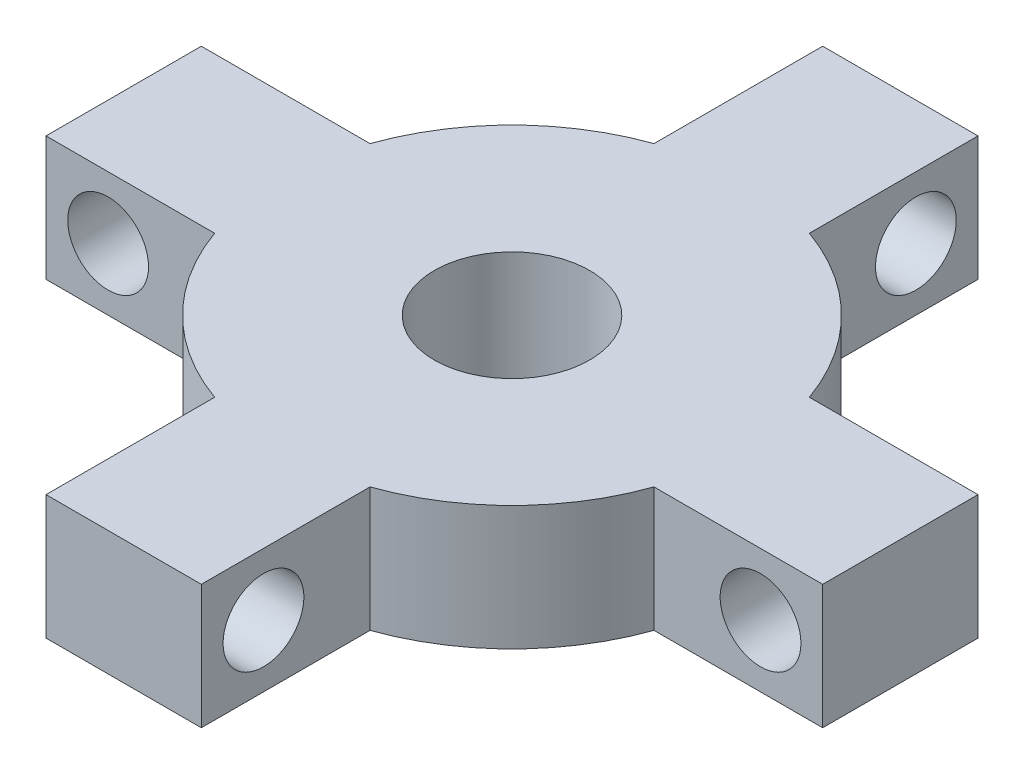
ISO-10303-21;
HEADER;
FILE_DESCRIPTION(('STEP AP214'),'2;1');
FILE_NAME('part.step','',(''),(''),'','','');
FILE_SCHEMA(('AUTOMOTIVE_DESIGN { 1 0 10303 214 1 1 1 1 }'));
ENDSEC;
DATA;
#1=APPLICATION_CONTEXT('core data for automotive mechanical design processes');
#2=APPLICATION_PROTOCOL_DEFINITION('international standard','automotive_design',2000,#1);
#3=PRODUCT_CONTEXT('',#1,'mechanical');
#4=PRODUCT('Part','Part','',(#3));
#5=PRODUCT_RELATED_PRODUCT_CATEGORY('part','',(#4));
#6=PRODUCT_DEFINITION_FORMATION('','',#4);
#7=PRODUCT_DEFINITION_CONTEXT('part definition',#1,'design');
#8=PRODUCT_DEFINITION('design','',#6,#7);
#9=PRODUCT_DEFINITION_SHAPE('','',#8);
#10=(LENGTH_UNIT() NAMED_UNIT(*) SI_UNIT(.MILLI.,.METRE.));
#11=(NAMED_UNIT(*) PLANE_ANGLE_UNIT() SI_UNIT($,.RADIAN.));
#12=(NAMED_UNIT(*) SI_UNIT($,.STERADIAN.) SOLID_ANGLE_UNIT());
#13=UNCERTAINTY_MEASURE_WITH_UNIT(LENGTH_MEASURE(1.E-05),#10,'distance_accuracy_value','');
#14=(GEOMETRIC_REPRESENTATION_CONTEXT(3) GLOBAL_UNCERTAINTY_ASSIGNED_CONTEXT((#13)) GLOBAL_UNIT_ASSIGNED_CONTEXT((#10,
#11,#12)) REPRESENTATION_CONTEXT('',''));
#15=CARTESIAN_POINT('',(0.,0.,0.));
#16=DIRECTION('',(0.,0.,1.));
#17=DIRECTION('',(1.,0.,0.));
#18=AXIS2_PLACEMENT_3D('',#15,#16,#17);
#19=CARTESIAN_POINT('',(0.,10.16,0.));
#20=DIRECTION('',(0.,-1.,0.));
#21=DIRECTION('',(0.,0.,-1.));
#22=AXIS2_PLACEMENT_3D('',#19,#20,#21);
#23=CYLINDRICAL_SURFACE('',#22,19.05);
#24=DIRECTION('',(0.,1.,0.));
#25=VECTOR('',#24,1.);
#26=CARTESIAN_POINT('',(-17.9605122421384,-6.44278538945158,-6.34999999999981));
#27=LINE('',#26,#25);
#28=CARTESIAN_POINT('',(-17.9605122421384,0.,-6.34999999999981));
#29=VERTEX_POINT('',#28);
#30=CARTESIAN_POINT('',(-17.9605122421384,10.16,-6.34999999999981));
#31=VERTEX_POINT('',#30);
#32=EDGE_CURVE('E120',#29,#31,#27,.T.);
#33=ORIENTED_EDGE('',*,*,#32,.T.);
#34=CARTESIAN_POINT('',(0.,10.16,0.));
#35=DIRECTION('',(0.,1.,0.));
#36=DIRECTION('',(0.,0.,1.));
#37=AXIS2_PLACEMENT_3D('',#34,#35,#36);
#38=CIRCLE('',#37,19.05);
#39=CARTESIAN_POINT('',(-6.35,10.16,-17.9605122421383));
#40=VERTEX_POINT('',#39);
#41=EDGE_CURVE('E447',#40,#31,#38,.T.);
#42=ORIENTED_EDGE('',*,*,#41,.F.);
#43=DIRECTION('',(0.,1.,0.));
#44=VECTOR('',#43,1.);
#45=CARTESIAN_POINT('',(-6.35,-6.44278538945156,-17.9605122421383));
#46=LINE('',#45,#44);
#47=CARTESIAN_POINT('',(-6.35,0.,-17.9605122421383));
#48=VERTEX_POINT('',#47);
#49=EDGE_CURVE('E308',#48,#40,#46,.T.);
#50=ORIENTED_EDGE('',*,*,#49,.F.);
#51=CARTESIAN_POINT('',(0.,0.,0.));
#52=DIRECTION('',(0.,1.,0.));
#53=DIRECTION('',(0.,0.,1.));
#54=AXIS2_PLACEMENT_3D('',#51,#52,#53);
#55=CIRCLE('',#54,19.05);
#56=EDGE_CURVE('E125',#48,#29,#55,.T.);
#57=ORIENTED_EDGE('',*,*,#56,.T.);
#58=EDGE_LOOP('',(#33,#42,#50,#57));
#59=FACE_BOUND('',#58,.T.);
#60=ADVANCED_FACE('F101',(#59),#23,.T.);
#61=DIRECTION('',(0.,1.,0.));
#62=VECTOR('',#61,1.);
#63=CARTESIAN_POINT('',(6.35,-6.44278538945156,-17.9605122421383));
#64=LINE('',#63,#62);
#65=CARTESIAN_POINT('',(6.35,0.,-17.9605122421383));
#66=VERTEX_POINT('',#65);
#67=CARTESIAN_POINT('',(6.35,10.16,-17.9605122421383));
#68=VERTEX_POINT('',#67);
#69=EDGE_CURVE('E226',#66,#68,#64,.T.);
#70=ORIENTED_EDGE('',*,*,#69,.T.);
#71=CARTESIAN_POINT('',(17.9605122421383,10.16,-6.35000000000006));
#72=VERTEX_POINT('',#71);
#73=EDGE_CURVE('E111',#72,#68,#38,.T.);
#74=ORIENTED_EDGE('',*,*,#73,.F.);
#75=DIRECTION('',(0.,1.,0.));
#76=VECTOR('',#75,1.);
#77=CARTESIAN_POINT('',(17.9605122421383,-6.44278538945157,-6.35000000000006));
#78=LINE('',#77,#76);
#79=CARTESIAN_POINT('',(17.9605122421383,0.,-6.35000000000006));
#80=VERTEX_POINT('',#79);
#81=EDGE_CURVE('E230',#80,#72,#78,.T.);
#82=ORIENTED_EDGE('',*,*,#81,.F.);
#83=EDGE_CURVE('E391',#80,#66,#55,.T.);
#84=ORIENTED_EDGE('',*,*,#83,.T.);
#85=EDGE_LOOP('',(#70,#74,#82,#84));
#86=FACE_BOUND('',#85,.T.);
#87=ADVANCED_FACE('F445',(#86),#23,.T.);
#88=DIRECTION('',(0.,1.,0.));
#89=VECTOR('',#88,1.);
#90=CARTESIAN_POINT('',(17.9605122421383,-6.44278538945157,6.34999999999993));
#91=LINE('',#90,#89);
#92=CARTESIAN_POINT('',(17.9605122421383,0.,6.34999999999994));
#93=VERTEX_POINT('',#92);
#94=CARTESIAN_POINT('',(17.9605122421383,10.16,6.34999999999994));
#95=VERTEX_POINT('',#94);
#96=EDGE_CURVE('E341',#93,#95,#91,.T.);
#97=ORIENTED_EDGE('',*,*,#96,.T.);
#98=CARTESIAN_POINT('',(6.35,10.16,17.9605122421383));
#99=VERTEX_POINT('',#98);
#100=EDGE_CURVE('E12',#99,#95,#38,.T.);
#101=ORIENTED_EDGE('',*,*,#100,.F.);
#102=DIRECTION('',(0.,1.,0.));
#103=VECTOR('',#102,1.);
#104=CARTESIAN_POINT('',(6.35,-6.44278538945156,17.9605122421383));
#105=LINE('',#104,#103);
#106=CARTESIAN_POINT('',(6.35,0.,17.9605122421383));
#107=VERTEX_POINT('',#106);
#108=EDGE_CURVE('E340',#107,#99,#105,.T.);
#109=ORIENTED_EDGE('',*,*,#108,.F.);
#110=EDGE_CURVE('E388',#107,#93,#55,.T.);
#111=ORIENTED_EDGE('',*,*,#110,.T.);
#112=EDGE_LOOP('',(#97,#101,#109,#111));
#113=FACE_BOUND('',#112,.T.);
#114=ADVANCED_FACE('F427',(#113),#23,.T.);
#115=CARTESIAN_POINT('',(-17.9605122421382,10.16,6.35000000000019));
#116=VERTEX_POINT('',#115);
#117=CARTESIAN_POINT('',(-6.35,10.16,17.9605122421383));
#118=VERTEX_POINT('',#117);
#119=EDGE_CURVE('E113',#116,#118,#38,.T.);
#120=ORIENTED_EDGE('',*,*,#119,.F.);
#121=DIRECTION('',(0.,1.,0.));
#122=VECTOR('',#121,1.);
#123=CARTESIAN_POINT('',(-17.9605122421382,-6.44278538945158,6.35000000000019));
#124=LINE('',#123,#122);
#125=CARTESIAN_POINT('',(-17.9605122421382,0.,6.35000000000019));
#126=VERTEX_POINT('',#125);
#127=EDGE_CURVE('E294',#126,#116,#124,.T.);
#128=ORIENTED_EDGE('',*,*,#127,.F.);
#129=CARTESIAN_POINT('',(-6.35,0.,17.9605122421383));
#130=VERTEX_POINT('',#129);
#131=EDGE_CURVE('E392',#126,#130,#55,.T.);
#132=ORIENTED_EDGE('',*,*,#131,.T.);
#133=DIRECTION('',(0.,1.,0.));
#134=VECTOR('',#133,1.);
#135=CARTESIAN_POINT('',(-6.35,-6.44278538945156,17.9605122421383));
#136=LINE('',#135,#134);
#137=EDGE_CURVE('E377',#130,#118,#136,.T.);
#138=ORIENTED_EDGE('',*,*,#137,.T.);
#139=EDGE_LOOP('',(#120,#128,#132,#138));
#140=FACE_BOUND('',#139,.T.);
#141=ADVANCED_FACE('F103',(#140),#23,.T.);
#142=CARTESIAN_POINT('',(0.,10.16,0.));
#143=DIRECTION('',(0.,1.,0.));
#144=DIRECTION('',(0.,0.,1.));
#145=AXIS2_PLACEMENT_3D('',#142,#143,#144);
#146=PLANE('',#145);
#147=DIRECTION('',(0.,0.,1.));
#148=VECTOR('',#147,1.);
#149=CARTESIAN_POINT('',(6.35,10.16,0.));
#150=LINE('',#149,#148);
#151=CARTESIAN_POINT('',(6.35,10.16,31.75));
#152=VERTEX_POINT('',#151);
#153=EDGE_CURVE('E359',#99,#152,#150,.T.);
#154=ORIENTED_EDGE('',*,*,#153,.F.);
#155=ORIENTED_EDGE('',*,*,#100,.T.);
#156=DIRECTION('',(-1.,0.,0.));
#157=VECTOR('',#156,1.);
#158=CARTESIAN_POINT('',(0.,10.16,6.35));
#159=LINE('',#158,#157);
#160=CARTESIAN_POINT('',(31.75,10.16,6.34999999999989));
#161=VERTEX_POINT('',#160);
#162=EDGE_CURVE('E330',#161,#95,#159,.T.);
#163=ORIENTED_EDGE('',*,*,#162,.F.);
#164=DIRECTION('',(0.,0.,1.));
#165=VECTOR('',#164,1.);
#166=CARTESIAN_POINT('',(31.75,10.16,6.34999999999989));
#167=LINE('',#166,#165);
#168=CARTESIAN_POINT('',(31.75,10.16,-6.35000000000011));
#169=VERTEX_POINT('',#168);
#170=EDGE_CURVE('E274',#169,#161,#167,.T.);
#171=ORIENTED_EDGE('',*,*,#170,.F.);
#172=DIRECTION('',(-1.,0.,0.));
#173=VECTOR('',#172,1.);
#174=CARTESIAN_POINT('',(0.,10.16,-6.35));
#175=LINE('',#174,#173);
#176=EDGE_CURVE('E331',#169,#72,#175,.T.);
#177=ORIENTED_EDGE('',*,*,#176,.T.);
#178=ORIENTED_EDGE('',*,*,#73,.T.);
#179=DIRECTION('',(0.,0.,1.));
#180=VECTOR('',#179,1.);
#181=CARTESIAN_POINT('',(6.35,10.16,0.));
#182=LINE('',#181,#180);
#183=CARTESIAN_POINT('',(6.35,10.16,-31.75));
#184=VERTEX_POINT('',#183);
#185=EDGE_CURVE('E316',#184,#68,#182,.T.);
#186=ORIENTED_EDGE('',*,*,#185,.F.);
#187=DIRECTION('',(1.,0.,0.));
#188=VECTOR('',#187,1.);
#189=CARTESIAN_POINT('',(6.35,10.16,-31.75));
#190=LINE('',#189,#188);
#191=CARTESIAN_POINT('',(-6.35,10.16,-31.75));
#192=VERTEX_POINT('',#191);
#193=EDGE_CURVE('E247',#192,#184,#190,.T.);
#194=ORIENTED_EDGE('',*,*,#193,.F.);
#195=DIRECTION('',(0.,0.,1.));
#196=VECTOR('',#195,1.);
#197=CARTESIAN_POINT('',(-6.35,10.16,0.));
#198=LINE('',#197,#196);
#199=EDGE_CURVE('E317',#192,#40,#198,.T.);
#200=ORIENTED_EDGE('',*,*,#199,.T.);
#201=ORIENTED_EDGE('',*,*,#41,.T.);
#202=DIRECTION('',(1.,0.,0.));
#203=VECTOR('',#202,1.);
#204=CARTESIAN_POINT('',(0.,10.16,-6.35));
#205=LINE('',#204,#203);
#206=CARTESIAN_POINT('',(-31.7500000000001,10.16,-6.34999999999966));
#207=VERTEX_POINT('',#206);
#208=EDGE_CURVE('E298',#207,#31,#205,.T.);
#209=ORIENTED_EDGE('',*,*,#208,.F.);
#210=DIRECTION('',(0.,0.,-1.));
#211=VECTOR('',#210,1.);
#212=CARTESIAN_POINT('',(-31.7500000000001,10.16,-6.34999999999966));
#213=LINE('',#212,#211);
#214=CARTESIAN_POINT('',(-31.7499999999999,10.16,6.35000000000033));
#215=VERTEX_POINT('',#214);
#216=EDGE_CURVE('E290',#215,#207,#213,.T.);
#217=ORIENTED_EDGE('',*,*,#216,.F.);
#218=DIRECTION('',(1.,0.,0.));
#219=VECTOR('',#218,1.);
#220=CARTESIAN_POINT('',(0.,10.16,6.35));
#221=LINE('',#220,#219);
#222=EDGE_CURVE('E299',#215,#116,#221,.T.);
#223=ORIENTED_EDGE('',*,*,#222,.T.);
#224=ORIENTED_EDGE('',*,*,#119,.T.);
#225=DIRECTION('',(0.,0.,-1.));
#226=VECTOR('',#225,1.);
#227=CARTESIAN_POINT('',(-6.35,10.16,0.));
#228=LINE('',#227,#226);
#229=CARTESIAN_POINT('',(-6.35,10.16,31.75));
#230=VERTEX_POINT('',#229);
#231=EDGE_CURVE('E372',#230,#118,#228,.T.);
#232=ORIENTED_EDGE('',*,*,#231,.F.);
#233=DIRECTION('',(1.,0.,0.));
#234=VECTOR('',#233,1.);
#235=CARTESIAN_POINT('',(0.,10.16,31.75));
#236=LINE('',#235,#234);
#237=EDGE_CURVE('E350',#230,#152,#236,.T.);
#238=ORIENTED_EDGE('',*,*,#237,.T.);
#239=EDGE_LOOP('',(#154,#155,#163,#171,#177,#178,#186,#194,#200,#201,#209,#217,#223,#224,#232,#238));
#240=FACE_BOUND('',#239,.T.);
#241=CARTESIAN_POINT('',(0.,10.16,0.));
#242=DIRECTION('',(0.,1.,0.));
#243=DIRECTION('',(0.,0.,1.));
#244=AXIS2_PLACEMENT_3D('',#241,#242,#243);
#245=CIRCLE('',#244,6.35);
#246=CARTESIAN_POINT('',(0.,10.16,6.35));
#247=VERTEX_POINT('',#246);
#248=EDGE_CURVE('E376',#247,#247,#245,.T.);
#249=ORIENTED_EDGE('',*,*,#248,.F.);
#250=EDGE_LOOP('',(#249));
#251=FACE_BOUND('',#250,.T.);
#252=ADVANCED_FACE('F430',(#240,#251),#146,.T.);
#253=CARTESIAN_POINT('',(0.,0.,0.));
#254=DIRECTION('',(0.,1.,0.));
#255=DIRECTION('',(0.,0.,1.));
#256=AXIS2_PLACEMENT_3D('',#253,#254,#255);
#257=PLANE('',#256);
#258=ORIENTED_EDGE('',*,*,#110,.F.);
#259=DIRECTION('',(0.,0.,-1.));
#260=VECTOR('',#259,1.);
#261=CARTESIAN_POINT('',(6.35,0.,0.));
#262=LINE('',#261,#260);
#263=CARTESIAN_POINT('',(6.35,0.,31.75));
#264=VERTEX_POINT('',#263);
#265=EDGE_CURVE('E351',#264,#107,#262,.T.);
#266=ORIENTED_EDGE('',*,*,#265,.F.);
#267=DIRECTION('',(-1.,0.,0.));
#268=VECTOR('',#267,1.);
#269=CARTESIAN_POINT('',(0.,0.,31.75));
#270=LINE('',#269,#268);
#271=CARTESIAN_POINT('',(-6.35,0.,31.75));
#272=VERTEX_POINT('',#271);
#273=EDGE_CURVE('E354',#264,#272,#270,.T.);
#274=ORIENTED_EDGE('',*,*,#273,.T.);
#275=DIRECTION('',(0.,0.,1.));
#276=VECTOR('',#275,1.);
#277=CARTESIAN_POINT('',(-6.35,0.,0.));
#278=LINE('',#277,#276);
#279=EDGE_CURVE('E373',#130,#272,#278,.T.);
#280=ORIENTED_EDGE('',*,*,#279,.F.);
#281=ORIENTED_EDGE('',*,*,#131,.F.);
#282=DIRECTION('',(-1.,0.,0.));
#283=VECTOR('',#282,1.);
#284=CARTESIAN_POINT('',(0.,0.,6.35));
#285=LINE('',#284,#283);
#286=CARTESIAN_POINT('',(-31.7499999999999,0.,6.35000000000033));
#287=VERTEX_POINT('',#286);
#288=EDGE_CURVE('E295',#126,#287,#285,.T.);
#289=ORIENTED_EDGE('',*,*,#288,.T.);
#290=DIRECTION('',(0.,0.,1.));
#291=VECTOR('',#290,1.);
#292=CARTESIAN_POINT('',(-31.7500000000001,0.,-6.34999999999966));
#293=LINE('',#292,#291);
#294=CARTESIAN_POINT('',(-31.7500000000001,0.,-6.34999999999966));
#295=VERTEX_POINT('',#294);
#296=EDGE_CURVE('E282',#295,#287,#293,.T.);
#297=ORIENTED_EDGE('',*,*,#296,.F.);
#298=DIRECTION('',(-1.,0.,0.));
#299=VECTOR('',#298,1.);
#300=CARTESIAN_POINT('',(0.,0.,-6.35));
#301=LINE('',#300,#299);
#302=EDGE_CURVE('E305',#29,#295,#301,.T.);
#303=ORIENTED_EDGE('',*,*,#302,.F.);
#304=ORIENTED_EDGE('',*,*,#56,.F.);
#305=DIRECTION('',(0.,0.,-1.));
#306=VECTOR('',#305,1.);
#307=CARTESIAN_POINT('',(-6.35,0.,0.));
#308=LINE('',#307,#306);
#309=CARTESIAN_POINT('',(-6.35,0.,-31.75));
#310=VERTEX_POINT('',#309);
#311=EDGE_CURVE('E237',#48,#310,#308,.T.);
#312=ORIENTED_EDGE('',*,*,#311,.T.);
#313=DIRECTION('',(-1.,0.,0.));
#314=VECTOR('',#313,1.);
#315=CARTESIAN_POINT('',(6.35,0.,-31.75));
#316=LINE('',#315,#314);
#317=CARTESIAN_POINT('',(6.35,0.,-31.75));
#318=VERTEX_POINT('',#317);
#319=EDGE_CURVE('E233',#318,#310,#316,.T.);
#320=ORIENTED_EDGE('',*,*,#319,.F.);
#321=DIRECTION('',(0.,0.,-1.));
#322=VECTOR('',#321,1.);
#323=CARTESIAN_POINT('',(6.35,0.,0.));
#324=LINE('',#323,#322);
#325=EDGE_CURVE('E220',#66,#318,#324,.T.);
#326=ORIENTED_EDGE('',*,*,#325,.F.);
#327=ORIENTED_EDGE('',*,*,#83,.F.);
#328=DIRECTION('',(1.,0.,0.));
#329=VECTOR('',#328,1.);
#330=CARTESIAN_POINT('',(0.,0.,-6.35));
#331=LINE('',#330,#329);
#332=CARTESIAN_POINT('',(31.75,0.,-6.35000000000011));
#333=VERTEX_POINT('',#332);
#334=EDGE_CURVE('E327',#80,#333,#331,.T.);
#335=ORIENTED_EDGE('',*,*,#334,.T.);
#336=DIRECTION('',(0.,0.,-1.));
#337=VECTOR('',#336,1.);
#338=CARTESIAN_POINT('',(31.75,0.,6.34999999999989));
#339=LINE('',#338,#337);
#340=CARTESIAN_POINT('',(31.75,0.,6.34999999999989));
#341=VERTEX_POINT('',#340);
#342=EDGE_CURVE('E266',#341,#333,#339,.T.);
#343=ORIENTED_EDGE('',*,*,#342,.F.);
#344=DIRECTION('',(1.,0.,0.));
#345=VECTOR('',#344,1.);
#346=CARTESIAN_POINT('',(0.,0.,6.35));
#347=LINE('',#346,#345);
#348=EDGE_CURVE('E337',#93,#341,#347,.T.);
#349=ORIENTED_EDGE('',*,*,#348,.F.);
#350=EDGE_LOOP('',(#258,#266,#274,#280,#281,#289,#297,#303,#304,#312,#320,#326,#327,#335,#343,#349));
#351=FACE_BOUND('',#350,.T.);
#352=CARTESIAN_POINT('',(0.,0.,0.));
#353=DIRECTION('',(0.,1.,0.));
#354=DIRECTION('',(0.,0.,1.));
#355=AXIS2_PLACEMENT_3D('',#352,#353,#354);
#356=CIRCLE('',#355,6.35);
#357=CARTESIAN_POINT('',(0.,0.,6.35));
#358=VERTEX_POINT('',#357);
#359=EDGE_CURVE('E386',#358,#358,#356,.T.);
#360=ORIENTED_EDGE('',*,*,#359,.T.);
#361=EDGE_LOOP('',(#360));
#362=FACE_BOUND('',#361,.T.);
#363=ADVANCED_FACE('F235',(#351,#362),#257,.F.);
#364=CARTESIAN_POINT('',(0.,-5.334,0.));
#365=DIRECTION('',(0.,1.,0.));
#366=DIRECTION('',(0.,0.,1.));
#367=AXIS2_PLACEMENT_3D('',#364,#365,#366);
#368=CYLINDRICAL_SURFACE('',#367,6.35);
#369=CARTESIAN_POINT('',(0.,10.16,6.35));
#370=CARTESIAN_POINT('',(0.,10.0541666666667,6.35));
#371=CARTESIAN_POINT('',(0.,9.94833333333333,6.35));
#372=CARTESIAN_POINT('',(0.,9.73666666666667,6.35));
#373=CARTESIAN_POINT('',(0.,9.63083333333333,6.35));
#374=CARTESIAN_POINT('',(0.,9.41916666666667,6.35));
#375=CARTESIAN_POINT('',(0.,9.31333333333333,6.35));
#376=CARTESIAN_POINT('',(0.,9.10166666666667,6.35));
#377=CARTESIAN_POINT('',(0.,8.99583333333333,6.35));
#378=CARTESIAN_POINT('',(0.,8.78416666666667,6.35));
#379=CARTESIAN_POINT('',(0.,8.67833333333333,6.35));
#380=CARTESIAN_POINT('',(0.,8.46666666666667,6.35));
#381=CARTESIAN_POINT('',(0.,8.36083333333333,6.35));
#382=CARTESIAN_POINT('',(0.,8.14916666666667,6.35));
#383=CARTESIAN_POINT('',(0.,8.04333333333333,6.35));
#384=CARTESIAN_POINT('',(0.,7.83166666666667,6.35));
#385=CARTESIAN_POINT('',(0.,7.72583333333333,6.35));
#386=CARTESIAN_POINT('',(0.,7.51416666666666,6.35));
#387=CARTESIAN_POINT('',(0.,7.40833333333333,6.35));
#388=CARTESIAN_POINT('',(0.,7.19666666666666,6.35));
#389=CARTESIAN_POINT('',(0.,7.09083333333333,6.35));
#390=CARTESIAN_POINT('',(0.,6.87916666666666,6.35));
#391=CARTESIAN_POINT('',(0.,6.77333333333333,6.35));
#392=CARTESIAN_POINT('',(0.,6.56166666666666,6.35));
#393=CARTESIAN_POINT('',(0.,6.45583333333333,6.35));
#394=CARTESIAN_POINT('',(0.,6.24416666666666,6.35));
#395=CARTESIAN_POINT('',(0.,6.13833333333333,6.35));
#396=CARTESIAN_POINT('',(0.,5.92666666666667,6.35));
#397=CARTESIAN_POINT('',(0.,5.82083333333333,6.35));
#398=CARTESIAN_POINT('',(0.,5.60916666666667,6.35));
#399=CARTESIAN_POINT('',(0.,5.50333333333333,6.35));
#400=CARTESIAN_POINT('',(0.,5.29166666666667,6.35));
#401=CARTESIAN_POINT('',(0.,5.18583333333333,6.35));
#402=CARTESIAN_POINT('',(0.,4.97416666666667,6.35));
#403=CARTESIAN_POINT('',(0.,4.86833333333333,6.35));
#404=CARTESIAN_POINT('',(0.,4.65666666666667,6.35));
#405=CARTESIAN_POINT('',(0.,4.55083333333333,6.35));
#406=CARTESIAN_POINT('',(0.,4.33916666666666,6.35));
#407=CARTESIAN_POINT('',(0.,4.23333333333333,6.35));
#408=CARTESIAN_POINT('',(0.,4.02166666666667,6.35));
#409=CARTESIAN_POINT('',(0.,3.91583333333333,6.35));
#410=CARTESIAN_POINT('',(0.,3.70416666666666,6.35));
#411=CARTESIAN_POINT('',(0.,3.59833333333333,6.35));
#412=CARTESIAN_POINT('',(0.,3.38666666666666,6.35));
#413=CARTESIAN_POINT('',(0.,3.28083333333333,6.35));
#414=CARTESIAN_POINT('',(0.,3.06916666666666,6.35));
#415=CARTESIAN_POINT('',(0.,2.96333333333333,6.35));
#416=CARTESIAN_POINT('',(0.,2.75166666666667,6.35));
#417=CARTESIAN_POINT('',(0.,2.64583333333333,6.35));
#418=CARTESIAN_POINT('',(0.,2.43416666666667,6.35));
#419=CARTESIAN_POINT('',(0.,2.32833333333333,6.35));
#420=CARTESIAN_POINT('',(0.,2.11666666666667,6.35));
#421=CARTESIAN_POINT('',(0.,2.01083333333333,6.35));
#422=CARTESIAN_POINT('',(0.,1.79916666666667,6.35));
#423=CARTESIAN_POINT('',(0.,1.69333333333333,6.35));
#424=CARTESIAN_POINT('',(0.,1.48166666666667,6.35));
#425=CARTESIAN_POINT('',(0.,1.37583333333333,6.35));
#426=CARTESIAN_POINT('',(0.,1.16416666666667,6.35));
#427=CARTESIAN_POINT('',(0.,1.05833333333333,6.35));
#428=CARTESIAN_POINT('',(0.,0.846666666666666,6.35));
#429=CARTESIAN_POINT('',(0.,0.740833333333333,6.35));
#430=CARTESIAN_POINT('',(0.,0.529166666666666,6.35));
#431=CARTESIAN_POINT('',(0.,0.423333333333333,6.35));
#432=CARTESIAN_POINT('',(0.,0.211666666666666,6.35));
#433=CARTESIAN_POINT('',(0.,0.105833333333332,6.35));
#434=CARTESIAN_POINT('',(0.,0.,6.35));
#435=B_SPLINE_CURVE_WITH_KNOTS('',3,(#369,#370,#371,#372,#373,#374,#375,#376,#377,#378,#379,
#380,#381,#382,#383,#384,#385,#386,#387,#388,#389,#390,#391,#392,#393,#394,#395,#396,#397,#398,
#399,#400,#401,#402,#403,#404,#405,#406,#407,#408,#409,#410,#411,#412,#413,#414,#415,#416,#417,
#418,#419,#420,#421,#422,#423,#424,#425,#426,#427,#428,#429,#430,#431,#432,#433,#434),
.UNSPECIFIED.,.F.,.F.,(4,2,2,2,2,2,2,2,2,2,2,2,2,2,2,2,2,2,2,2,2,2,2,2,2,2,2,2,2,2,2,2,4),(0.,
0.3175,0.635,0.9525,1.27,1.5875,1.905,2.2225,2.54,2.8575,3.175,3.4925,3.81,4.1275,4.445,4.7625,
5.08,5.3975,5.715,6.0325,6.35,6.6675,6.985,7.3025,7.62,7.9375,8.255,8.5725,8.89,9.2075,9.525,
9.8425,10.16),.UNSPECIFIED.);
#436=EDGE_CURVE('BSEAM635',#247,#358,#435,.T.);
#437=ORIENTED_EDGE('',*,*,#248,.T.);
#438=ORIENTED_EDGE('',*,*,#359,.F.);
#439=ORIENTED_EDGE('',*,*,#436,.T.);
#440=ORIENTED_EDGE('',*,*,#436,.F.);
#441=EDGE_LOOP('',(#437,#439,#438,#440));
#442=FACE_BOUND('',#441,.T.);
#443=ADVANCED_FACE('F635',(#442),#368,.F.);
#444=CARTESIAN_POINT('',(-6.35,-6.44278538945156,0.));
#445=DIRECTION('',(1.,0.,0.));
#446=DIRECTION('',(0.,0.,-1.));
#447=AXIS2_PLACEMENT_3D('',#444,#445,#446);
#448=PLANE('',#447);
#449=CARTESIAN_POINT('',(-6.34999999999972,5.08,26.6700000000001));
#450=DIRECTION('',(-1.,0.,0.));
#451=DIRECTION('',(0.,0.,1.));
#452=AXIS2_PLACEMENT_3D('',#449,#450,#451);
#453=CIRCLE('',#452,3.302);
#454=CARTESIAN_POINT('',(-6.34999999999968,5.08,29.9720000000001));
#455=VERTEX_POINT('',#454);
#456=EDGE_CURVE('E619',#455,#455,#453,.T.);
#457=ORIENTED_EDGE('',*,*,#456,.F.);
#458=EDGE_LOOP('',(#457));
#459=FACE_BOUND('',#458,.T.);
#460=ORIENTED_EDGE('',*,*,#137,.F.);
#461=ORIENTED_EDGE('',*,*,#279,.T.);
#462=DIRECTION('',(0.,1.,0.));
#463=VECTOR('',#462,1.);
#464=CARTESIAN_POINT('',(-6.35,-17.9605122421383,31.75));
#465=LINE('',#464,#463);
#466=EDGE_CURVE('E363',#272,#230,#465,.T.);
#467=ORIENTED_EDGE('',*,*,#466,.T.);
#468=ORIENTED_EDGE('',*,*,#231,.T.);
#469=EDGE_LOOP('',(#460,#461,#467,#468));
#470=FACE_BOUND('',#469,.T.);
#471=ADVANCED_FACE('F458',(#459,#470),#448,.F.);
#472=CARTESIAN_POINT('',(6.35,-17.9605122421383,0.));
#473=DIRECTION('',(-1.,0.,0.));
#474=DIRECTION('',(0.,0.,1.));
#475=AXIS2_PLACEMENT_3D('',#472,#473,#474);
#476=PLANE('',#475);
#477=CARTESIAN_POINT('',(6.35,5.08,26.67));
#478=DIRECTION('',(-1.,0.,0.));
#479=DIRECTION('',(0.,0.,1.));
#480=AXIS2_PLACEMENT_3D('',#477,#478,#479);
#481=CIRCLE('',#480,3.302);
#482=CARTESIAN_POINT('',(6.35,5.08,29.972));
#483=VERTEX_POINT('',#482);
#484=EDGE_CURVE('E105',#483,#483,#481,.T.);
#485=ORIENTED_EDGE('',*,*,#484,.T.);
#486=EDGE_LOOP('',(#485));
#487=FACE_BOUND('',#486,.T.);
#488=DIRECTION('',(0.,1.,0.));
#489=VECTOR('',#488,1.);
#490=CARTESIAN_POINT('',(6.35,-17.9605122421383,31.75));
#491=LINE('',#490,#489);
#492=EDGE_CURVE('E355',#264,#152,#491,.T.);
#493=ORIENTED_EDGE('',*,*,#492,.F.);
#494=ORIENTED_EDGE('',*,*,#265,.T.);
#495=ORIENTED_EDGE('',*,*,#108,.T.);
#496=ORIENTED_EDGE('',*,*,#153,.T.);
#497=EDGE_LOOP('',(#493,#494,#495,#496));
#498=FACE_BOUND('',#497,.T.);
#499=ADVANCED_FACE('F436',(#487,#498),#476,.F.);
#500=CARTESIAN_POINT('',(0.,-17.9605122421383,31.75));
#501=DIRECTION('',(0.,0.,1.));
#502=DIRECTION('',(1.,0.,0.));
#503=AXIS2_PLACEMENT_3D('',#500,#501,#502);
#504=PLANE('',#503);
#505=ORIENTED_EDGE('',*,*,#273,.F.);
#506=ORIENTED_EDGE('',*,*,#492,.T.);
#507=ORIENTED_EDGE('',*,*,#237,.F.);
#508=ORIENTED_EDGE('',*,*,#466,.F.);
#509=EDGE_LOOP('',(#505,#506,#507,#508));
#510=FACE_BOUND('',#509,.T.);
#511=ADVANCED_FACE('F419',(#510),#504,.T.);
#512=CARTESIAN_POINT('',(0.,-6.44278538945157,6.35));
#513=DIRECTION('',(0.,0.,-1.));
#514=DIRECTION('',(-1.,0.,0.));
#515=AXIS2_PLACEMENT_3D('',#512,#513,#514);
#516=PLANE('',#515);
#517=CARTESIAN_POINT('',(26.67,5.08,6.35));
#518=DIRECTION('',(0.,0.,1.));
#519=DIRECTION('',(1.,0.,0.));
#520=AXIS2_PLACEMENT_3D('',#517,#518,#519);
#521=CIRCLE('',#520,3.302);
#522=CARTESIAN_POINT('',(29.972,5.08,6.35));
#523=VERTEX_POINT('',#522);
#524=EDGE_CURVE('E253',#523,#523,#521,.T.);
#525=ORIENTED_EDGE('',*,*,#524,.F.);
#526=EDGE_LOOP('',(#525));
#527=FACE_BOUND('',#526,.T.);
#528=ORIENTED_EDGE('',*,*,#96,.F.);
#529=ORIENTED_EDGE('',*,*,#348,.T.);
#530=DIRECTION('',(0.,-1.,0.));
#531=VECTOR('',#530,1.);
#532=CARTESIAN_POINT('',(31.75,10.16,6.34999999999989));
#533=LINE('',#532,#531);
#534=EDGE_CURVE('E262',#161,#341,#533,.T.);
#535=ORIENTED_EDGE('',*,*,#534,.F.);
#536=ORIENTED_EDGE('',*,*,#162,.T.);
#537=EDGE_LOOP('',(#528,#529,#535,#536));
#538=FACE_BOUND('',#537,.T.);
#539=ADVANCED_FACE('F415',(#527,#538),#516,.F.);
#540=CARTESIAN_POINT('',(0.,-6.44278538945157,-6.35));
#541=DIRECTION('',(0.,0.,-1.));
#542=DIRECTION('',(-1.,0.,0.));
#543=AXIS2_PLACEMENT_3D('',#540,#541,#542);
#544=PLANE('',#543);
#545=CARTESIAN_POINT('',(26.67,5.08,-6.3500000000001));
#546=DIRECTION('',(0.,0.,-1.));
#547=DIRECTION('',(-1.,0.,0.));
#548=AXIS2_PLACEMENT_3D('',#545,#546,#547);
#549=CIRCLE('',#548,3.302);
#550=CARTESIAN_POINT('',(23.368,5.08,-6.35000000000008));
#551=VERTEX_POINT('',#550);
#552=EDGE_CURVE('E249',#551,#551,#549,.T.);
#553=ORIENTED_EDGE('',*,*,#552,.F.);
#554=EDGE_LOOP('',(#553));
#555=FACE_BOUND('',#554,.T.);
#556=ORIENTED_EDGE('',*,*,#334,.F.);
#557=ORIENTED_EDGE('',*,*,#81,.T.);
#558=ORIENTED_EDGE('',*,*,#176,.F.);
#559=DIRECTION('',(0.,1.,0.));
#560=VECTOR('',#559,1.);
#561=CARTESIAN_POINT('',(31.75,10.16,-6.35000000000011));
#562=LINE('',#561,#560);
#563=EDGE_CURVE('E270',#333,#169,#562,.T.);
#564=ORIENTED_EDGE('',*,*,#563,.F.);
#565=EDGE_LOOP('',(#556,#557,#558,#564));
#566=FACE_BOUND('',#565,.T.);
#567=ADVANCED_FACE('F418',(#555,#566),#544,.T.);
#568=CARTESIAN_POINT('',(6.35,-6.44278538945156,0.));
#569=DIRECTION('',(-1.,0.,0.));
#570=DIRECTION('',(0.,0.,1.));
#571=AXIS2_PLACEMENT_3D('',#568,#569,#570);
#572=PLANE('',#571);
#573=CARTESIAN_POINT('',(6.3499999999999,5.08,-26.67));
#574=DIRECTION('',(1.,0.,0.));
#575=DIRECTION('',(0.,0.,-1.));
#576=AXIS2_PLACEMENT_3D('',#573,#574,#575);
#577=CIRCLE('',#576,3.302);
#578=CARTESIAN_POINT('',(6.34999999999989,5.08,-29.972));
#579=VERTEX_POINT('',#578);
#580=EDGE_CURVE('E400',#579,#579,#577,.T.);
#581=ORIENTED_EDGE('',*,*,#580,.F.);
#582=EDGE_LOOP('',(#581));
#583=FACE_BOUND('',#582,.T.);
#584=ORIENTED_EDGE('',*,*,#69,.F.);
#585=ORIENTED_EDGE('',*,*,#325,.T.);
#586=DIRECTION('',(0.,-1.,0.));
#587=VECTOR('',#586,1.);
#588=CARTESIAN_POINT('',(6.35,10.16,-31.75));
#589=LINE('',#588,#587);
#590=EDGE_CURVE('E225',#184,#318,#589,.T.);
#591=ORIENTED_EDGE('',*,*,#590,.F.);
#592=ORIENTED_EDGE('',*,*,#185,.T.);
#593=EDGE_LOOP('',(#584,#585,#591,#592));
#594=FACE_BOUND('',#593,.T.);
#595=ADVANCED_FACE('F222',(#583,#594),#572,.F.);
#596=CARTESIAN_POINT('',(-6.35,-6.44278538945156,0.));
#597=DIRECTION('',(-1.,0.,0.));
#598=DIRECTION('',(0.,0.,1.));
#599=AXIS2_PLACEMENT_3D('',#596,#597,#598);
#600=PLANE('',#599);
#601=CARTESIAN_POINT('',(-6.35,5.08,-26.67));
#602=DIRECTION('',(-1.,0.,0.));
#603=DIRECTION('',(0.,0.,1.));
#604=AXIS2_PLACEMENT_3D('',#601,#602,#603);
#605=CIRCLE('',#604,3.302);
#606=CARTESIAN_POINT('',(-6.35,5.08,-23.368));
#607=VERTEX_POINT('',#606);
#608=EDGE_CURVE('E399',#607,#607,#605,.T.);
#609=ORIENTED_EDGE('',*,*,#608,.F.);
#610=EDGE_LOOP('',(#609));
#611=FACE_BOUND('',#610,.T.);
#612=ORIENTED_EDGE('',*,*,#311,.F.);
#613=ORIENTED_EDGE('',*,*,#49,.T.);
#614=ORIENTED_EDGE('',*,*,#199,.F.);
#615=DIRECTION('',(0.,1.,0.));
#616=VECTOR('',#615,1.);
#617=CARTESIAN_POINT('',(-6.35,10.16,-31.75));
#618=LINE('',#617,#616);
#619=EDGE_CURVE('E242',#310,#192,#618,.T.);
#620=ORIENTED_EDGE('',*,*,#619,.F.);
#621=EDGE_LOOP('',(#612,#613,#614,#620));
#622=FACE_BOUND('',#621,.T.);
#623=ADVANCED_FACE('F482',(#611,#622),#600,.T.);
#624=CARTESIAN_POINT('',(0.,-6.44278538945158,-6.35));
#625=DIRECTION('',(0.,0.,1.));
#626=DIRECTION('',(1.,0.,0.));
#627=AXIS2_PLACEMENT_3D('',#624,#625,#626);
#628=PLANE('',#627);
#629=CARTESIAN_POINT('',(-26.67,5.08,-6.35));
#630=DIRECTION('',(0.,0.,-1.));
#631=DIRECTION('',(-1.,0.,0.));
#632=AXIS2_PLACEMENT_3D('',#629,#630,#631);
#633=CIRCLE('',#632,3.302);
#634=CARTESIAN_POINT('',(-29.972,5.08,-6.35));
#635=VERTEX_POINT('',#634);
#636=EDGE_CURVE('E622',#635,#635,#633,.T.);
#637=ORIENTED_EDGE('',*,*,#636,.F.);
#638=EDGE_LOOP('',(#637));
#639=FACE_BOUND('',#638,.T.);
#640=ORIENTED_EDGE('',*,*,#32,.F.);
#641=ORIENTED_EDGE('',*,*,#302,.T.);
#642=DIRECTION('',(0.,-1.,0.));
#643=VECTOR('',#642,1.);
#644=CARTESIAN_POINT('',(-31.7500000000001,10.16,-6.34999999999966));
#645=LINE('',#644,#643);
#646=EDGE_CURVE('E278',#207,#295,#645,.T.);
#647=ORIENTED_EDGE('',*,*,#646,.F.);
#648=ORIENTED_EDGE('',*,*,#208,.T.);
#649=EDGE_LOOP('',(#640,#641,#647,#648));
#650=FACE_BOUND('',#649,.T.);
#651=ADVANCED_FACE('F473',(#639,#650),#628,.F.);
#652=CARTESIAN_POINT('',(0.,-6.44278538945158,6.35));
#653=DIRECTION('',(0.,0.,1.));
#654=DIRECTION('',(1.,0.,0.));
#655=AXIS2_PLACEMENT_3D('',#652,#653,#654);
#656=PLANE('',#655);
#657=CARTESIAN_POINT('',(-26.67,5.08,6.35000000000028));
#658=DIRECTION('',(0.,0.,1.));
#659=DIRECTION('',(1.,0.,0.));
#660=AXIS2_PLACEMENT_3D('',#657,#658,#659);
#661=CIRCLE('',#660,3.302);
#662=CARTESIAN_POINT('',(-23.368,5.08,6.35000000000025));
#663=VERTEX_POINT('',#662);
#664=EDGE_CURVE('E396',#663,#663,#661,.T.);
#665=ORIENTED_EDGE('',*,*,#664,.F.);
#666=EDGE_LOOP('',(#665));
#667=FACE_BOUND('',#666,.T.);
#668=ORIENTED_EDGE('',*,*,#288,.F.);
#669=ORIENTED_EDGE('',*,*,#127,.T.);
#670=ORIENTED_EDGE('',*,*,#222,.F.);
#671=DIRECTION('',(0.,1.,0.));
#672=VECTOR('',#671,1.);
#673=CARTESIAN_POINT('',(-31.7499999999999,10.16,6.35000000000033));
#674=LINE('',#673,#672);
#675=EDGE_CURVE('E286',#287,#215,#674,.T.);
#676=ORIENTED_EDGE('',*,*,#675,.F.);
#677=EDGE_LOOP('',(#668,#669,#670,#676));
#678=FACE_BOUND('',#677,.T.);
#679=ADVANCED_FACE('F471',(#667,#678),#656,.T.);
#680=CARTESIAN_POINT('',(-31.75,0.,3.30783915271279E-13));
#681=DIRECTION('',(-1.,0.,0.));
#682=DIRECTION('',(0.,0.,1.));
#683=AXIS2_PLACEMENT_3D('',#680,#681,#682);
#684=PLANE('',#683);
#685=ORIENTED_EDGE('',*,*,#646,.T.);
#686=ORIENTED_EDGE('',*,*,#296,.T.);
#687=ORIENTED_EDGE('',*,*,#675,.T.);
#688=ORIENTED_EDGE('',*,*,#216,.T.);
#689=EDGE_LOOP('',(#685,#686,#687,#688));
#690=FACE_BOUND('',#689,.T.);
#691=ADVANCED_FACE('F469',(#690),#684,.T.);
#692=CARTESIAN_POINT('',(31.75,0.,-1.06791858138473E-13));
#693=DIRECTION('',(1.,0.,0.));
#694=DIRECTION('',(0.,0.,-1.));
#695=AXIS2_PLACEMENT_3D('',#692,#693,#694);
#696=PLANE('',#695);
#697=ORIENTED_EDGE('',*,*,#534,.T.);
#698=ORIENTED_EDGE('',*,*,#342,.T.);
#699=ORIENTED_EDGE('',*,*,#563,.T.);
#700=ORIENTED_EDGE('',*,*,#170,.T.);
#701=EDGE_LOOP('',(#697,#698,#699,#700));
#702=FACE_BOUND('',#701,.T.);
#703=ADVANCED_FACE('F439',(#702),#696,.T.);
#704=CARTESIAN_POINT('',(0.,0.,-31.75));
#705=DIRECTION('',(0.,0.,-1.));
#706=DIRECTION('',(-1.,0.,0.));
#707=AXIS2_PLACEMENT_3D('',#704,#705,#706);
#708=PLANE('',#707);
#709=ORIENTED_EDGE('',*,*,#590,.T.);
#710=ORIENTED_EDGE('',*,*,#319,.T.);
#711=ORIENTED_EDGE('',*,*,#619,.T.);
#712=ORIENTED_EDGE('',*,*,#193,.T.);
#713=EDGE_LOOP('',(#709,#710,#711,#712));
#714=FACE_BOUND('',#713,.T.);
#715=ADVANCED_FACE('F245',(#714),#708,.T.);
#716=CARTESIAN_POINT('',(26.67,5.08,-9.906));
#717=DIRECTION('',(0.,0.,1.));
#718=DIRECTION('',(1.,0.,0.));
#719=AXIS2_PLACEMENT_3D('',#716,#717,#718);
#720=CYLINDRICAL_SURFACE('',#719,3.302);
#721=ORIENTED_EDGE('',*,*,#552,.T.);
#722=EDGE_LOOP('',(#721));
#723=FACE_BOUND('',#722,.T.);
#724=ORIENTED_EDGE('',*,*,#524,.T.);
#725=EDGE_LOOP('',(#724));
#726=FACE_BOUND('',#725,.T.);
#727=ADVANCED_FACE('F413',(#723,#726),#720,.F.);
#728=CARTESIAN_POINT('',(-26.67,5.08,9.906));
#729=DIRECTION('',(0.,0.,-1.));
#730=DIRECTION('',(-1.,0.,0.));
#731=AXIS2_PLACEMENT_3D('',#728,#729,#730);
#732=CYLINDRICAL_SURFACE('',#731,3.302);
#733=ORIENTED_EDGE('',*,*,#664,.T.);
#734=EDGE_LOOP('',(#733));
#735=FACE_BOUND('',#734,.T.);
#736=ORIENTED_EDGE('',*,*,#636,.T.);
#737=EDGE_LOOP('',(#736));
#738=FACE_BOUND('',#737,.T.);
#739=ADVANCED_FACE('F585',(#735,#738),#732,.F.);
#740=CARTESIAN_POINT('',(-9.90600000000009,5.08,-26.67));
#741=DIRECTION('',(1.,0.,0.));
#742=DIRECTION('',(0.,0.,-1.));
#743=AXIS2_PLACEMENT_3D('',#740,#741,#742);
#744=CYLINDRICAL_SURFACE('',#743,3.302);
#745=ORIENTED_EDGE('',*,*,#608,.T.);
#746=EDGE_LOOP('',(#745));
#747=FACE_BOUND('',#746,.T.);
#748=ORIENTED_EDGE('',*,*,#580,.T.);
#749=EDGE_LOOP('',(#748));
#750=FACE_BOUND('',#749,.T.);
#751=ADVANCED_FACE('F593',(#747,#750),#744,.F.);
#752=CARTESIAN_POINT('',(9.90600000000028,5.08,26.6699999999999));
#753=DIRECTION('',(-1.,0.,0.));
#754=DIRECTION('',(0.,0.,1.));
#755=AXIS2_PLACEMENT_3D('',#752,#753,#754);
#756=CYLINDRICAL_SURFACE('',#755,3.302);
#757=ORIENTED_EDGE('',*,*,#456,.T.);
#758=EDGE_LOOP('',(#757));
#759=FACE_BOUND('',#758,.T.);
#760=ORIENTED_EDGE('',*,*,#484,.F.);
#761=EDGE_LOOP('',(#760));
#762=FACE_BOUND('',#761,.T.);
#763=ADVANCED_FACE('F602',(#759,#762),#756,.F.);
#764=CLOSED_SHELL('',(#60,#87,#114,#141,#252,#363,#443,#471,#499,#511,#539,#567,#595,#623,#651,
#679,#691,#703,#715,#727,#739,#751,#763));
#765=MANIFOLD_SOLID_BREP('B2',#764);
#766=ADVANCED_BREP_SHAPE_REPRESENTATION('',(#18,#765),#14);
#767=SHAPE_DEFINITION_REPRESENTATION(#9,#766);
ENDSEC;
END-ISO-10303-21;
